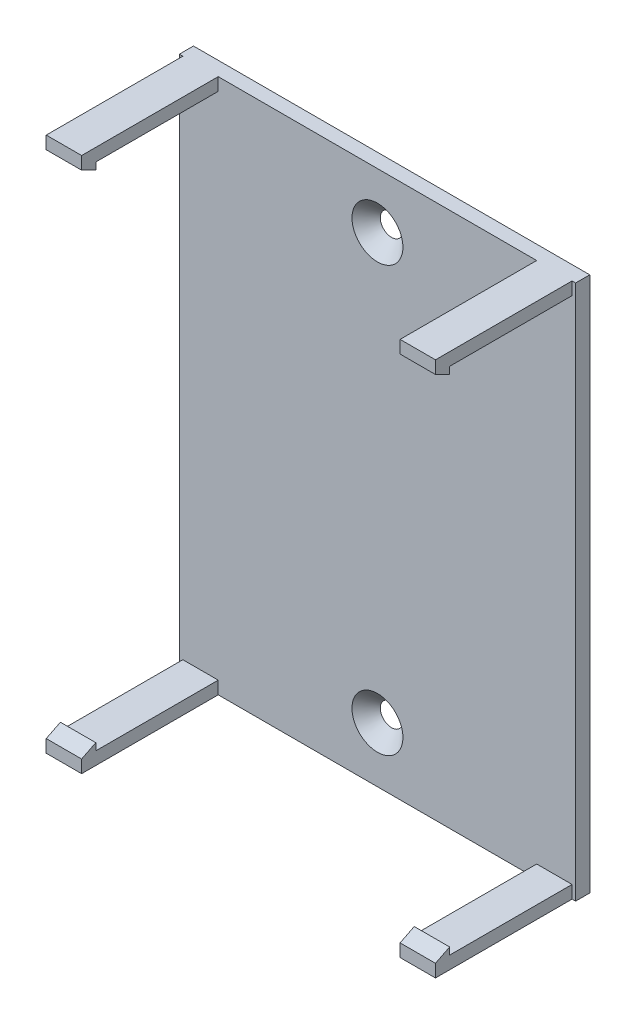
ISO-10303-21;
HEADER;
FILE_DESCRIPTION(('STEP AP214'),'2;1');
FILE_NAME('part.step','',(''),(''),'','','');
FILE_SCHEMA(('AUTOMOTIVE_DESIGN { 1 0 10303 214 1 1 1 1 }'));
ENDSEC;
DATA;
#1=APPLICATION_CONTEXT('core data for automotive mechanical design processes');
#2=APPLICATION_PROTOCOL_DEFINITION('international standard','automotive_design',2000,#1);
#3=PRODUCT_CONTEXT('',#1,'mechanical');
#4=PRODUCT('Part','Part','',(#3));
#5=PRODUCT_RELATED_PRODUCT_CATEGORY('part','',(#4));
#6=PRODUCT_DEFINITION_FORMATION('','',#4);
#7=PRODUCT_DEFINITION_CONTEXT('part definition',#1,'design');
#8=PRODUCT_DEFINITION('design','',#6,#7);
#9=PRODUCT_DEFINITION_SHAPE('','',#8);
#10=(LENGTH_UNIT() NAMED_UNIT(*) SI_UNIT(.MILLI.,.METRE.));
#11=(NAMED_UNIT(*) PLANE_ANGLE_UNIT() SI_UNIT($,.RADIAN.));
#12=(NAMED_UNIT(*) SI_UNIT($,.STERADIAN.) SOLID_ANGLE_UNIT());
#13=UNCERTAINTY_MEASURE_WITH_UNIT(LENGTH_MEASURE(1.E-05),#10,'distance_accuracy_value','');
#14=(GEOMETRIC_REPRESENTATION_CONTEXT(3) GLOBAL_UNCERTAINTY_ASSIGNED_CONTEXT((#13)) GLOBAL_UNIT_ASSIGNED_CONTEXT((#10,
#11,#12)) REPRESENTATION_CONTEXT('',''));
#15=CARTESIAN_POINT('',(0.,0.,0.));
#16=DIRECTION('',(0.,0.,1.));
#17=DIRECTION('',(1.,0.,0.));
#18=AXIS2_PLACEMENT_3D('',#15,#16,#17);
#19=CARTESIAN_POINT('',(0.,0.,2.));
#20=DIRECTION('',(0.,0.,1.));
#21=DIRECTION('',(1.,0.,0.));
#22=AXIS2_PLACEMENT_3D('',#19,#20,#21);
#23=PLANE('',#22);
#24=CARTESIAN_POINT('',(0.,-30.,2.));
#25=DIRECTION('',(0.,0.,1.));
#26=DIRECTION('',(1.,0.,0.));
#27=AXIS2_PLACEMENT_3D('',#24,#25,#26);
#28=CIRCLE('',#27,3.60000000000003);
#29=CARTESIAN_POINT('',(3.60000000000003,-30.,2.));
#30=VERTEX_POINT('',#29);
#31=EDGE_CURVE('E11',#30,#30,#28,.F.);
#32=ORIENTED_EDGE('',*,*,#31,.T.);
#33=EDGE_LOOP('',(#32));
#34=FACE_BOUND('',#33,.T.);
#35=CARTESIAN_POINT('',(0.,30.,2.));
#36=DIRECTION('',(0.,0.,1.));
#37=DIRECTION('',(1.,0.,0.));
#38=AXIS2_PLACEMENT_3D('',#35,#36,#37);
#39=CIRCLE('',#38,3.60000000000003);
#40=CARTESIAN_POINT('',(3.60000000000003,30.,2.));
#41=VERTEX_POINT('',#40);
#42=EDGE_CURVE('E44',#41,#41,#39,.F.);
#43=ORIENTED_EDGE('',*,*,#42,.T.);
#44=EDGE_LOOP('',(#43));
#45=FACE_BOUND('',#44,.T.);
#46=DIRECTION('',(1.,0.,0.));
#47=VECTOR('',#46,1.);
#48=CARTESIAN_POINT('',(-28.,-37.825,2.));
#49=LINE('',#48,#47);
#50=CARTESIAN_POINT('',(-22.5,-37.825,2.));
#51=VERTEX_POINT('',#50);
#52=CARTESIAN_POINT('',(22.5,-37.825,2.));
#53=VERTEX_POINT('',#52);
#54=EDGE_CURVE('E393',#51,#53,#49,.T.);
#55=ORIENTED_EDGE('',*,*,#54,.T.);
#56=DIRECTION('',(0.,-1.,0.));
#57=VECTOR('',#56,1.);
#58=CARTESIAN_POINT('',(22.5,-37.825,2.));
#59=LINE('',#58,#57);
#60=CARTESIAN_POINT('',(22.5,-36.025,2.));
#61=VERTEX_POINT('',#60);
#62=EDGE_CURVE('E478',#61,#53,#59,.T.);
#63=ORIENTED_EDGE('',*,*,#62,.F.);
#64=DIRECTION('',(-1.,0.,0.));
#65=VECTOR('',#64,1.);
#66=CARTESIAN_POINT('',(22.5,-36.025,2.));
#67=LINE('',#66,#65);
#68=CARTESIAN_POINT('',(27.5,-36.025,2.));
#69=VERTEX_POINT('',#68);
#70=EDGE_CURVE('E238',#69,#61,#67,.T.);
#71=ORIENTED_EDGE('',*,*,#70,.F.);
#72=DIRECTION('',(0.,1.,0.));
#73=VECTOR('',#72,1.);
#74=CARTESIAN_POINT('',(27.5,-37.825,2.));
#75=LINE('',#74,#73);
#76=CARTESIAN_POINT('',(27.5,-37.825,2.));
#77=VERTEX_POINT('',#76);
#78=EDGE_CURVE('E400',#77,#69,#75,.T.);
#79=ORIENTED_EDGE('',*,*,#78,.F.);
#80=CARTESIAN_POINT('',(28.,-37.825,2.));
#81=VERTEX_POINT('',#80);
#82=EDGE_CURVE('E391',#77,#81,#49,.T.);
#83=ORIENTED_EDGE('',*,*,#82,.T.);
#84=DIRECTION('',(0.,1.,0.));
#85=VECTOR('',#84,1.);
#86=CARTESIAN_POINT('',(28.,37.825,2.));
#87=LINE('',#86,#85);
#88=CARTESIAN_POINT('',(28.,37.825,2.));
#89=VERTEX_POINT('',#88);
#90=EDGE_CURVE('E351',#81,#89,#87,.T.);
#91=ORIENTED_EDGE('',*,*,#90,.T.);
#92=DIRECTION('',(-1.,0.,0.));
#93=VECTOR('',#92,1.);
#94=CARTESIAN_POINT('',(-28.,37.825,2.));
#95=LINE('',#94,#93);
#96=CARTESIAN_POINT('',(27.5,37.825,2.));
#97=VERTEX_POINT('',#96);
#98=EDGE_CURVE('E346',#89,#97,#95,.T.);
#99=ORIENTED_EDGE('',*,*,#98,.T.);
#100=DIRECTION('',(0.,1.,0.));
#101=VECTOR('',#100,1.);
#102=CARTESIAN_POINT('',(27.5,36.025,2.));
#103=LINE('',#102,#101);
#104=CARTESIAN_POINT('',(27.5,36.025,2.));
#105=VERTEX_POINT('',#104);
#106=EDGE_CURVE('E289',#105,#97,#103,.T.);
#107=ORIENTED_EDGE('',*,*,#106,.F.);
#108=DIRECTION('',(1.,0.,0.));
#109=VECTOR('',#108,1.);
#110=CARTESIAN_POINT('',(22.5,36.025,2.));
#111=LINE('',#110,#109);
#112=CARTESIAN_POINT('',(22.5,36.025,2.));
#113=VERTEX_POINT('',#112);
#114=EDGE_CURVE('E299',#113,#105,#111,.T.);
#115=ORIENTED_EDGE('',*,*,#114,.F.);
#116=DIRECTION('',(0.,-1.,0.));
#117=VECTOR('',#116,1.);
#118=CARTESIAN_POINT('',(22.5,36.025,2.));
#119=LINE('',#118,#117);
#120=CARTESIAN_POINT('',(22.5,37.825,2.));
#121=VERTEX_POINT('',#120);
#122=EDGE_CURVE('E284',#121,#113,#119,.T.);
#123=ORIENTED_EDGE('',*,*,#122,.F.);
#124=CARTESIAN_POINT('',(-22.5,37.825,2.));
#125=VERTEX_POINT('',#124);
#126=EDGE_CURVE('E344',#121,#125,#95,.T.);
#127=ORIENTED_EDGE('',*,*,#126,.T.);
#128=DIRECTION('',(0.,1.,0.));
#129=VECTOR('',#128,1.);
#130=CARTESIAN_POINT('',(-22.5,37.825,2.));
#131=LINE('',#130,#129);
#132=CARTESIAN_POINT('',(-22.5,36.025,2.));
#133=VERTEX_POINT('',#132);
#134=EDGE_CURVE('E318',#133,#125,#131,.T.);
#135=ORIENTED_EDGE('',*,*,#134,.F.);
#136=DIRECTION('',(1.,0.,0.));
#137=VECTOR('',#136,1.);
#138=CARTESIAN_POINT('',(-27.5,36.025,2.));
#139=LINE('',#138,#137);
#140=CARTESIAN_POINT('',(-27.5,36.025,2.));
#141=VERTEX_POINT('',#140);
#142=EDGE_CURVE('E326',#141,#133,#139,.T.);
#143=ORIENTED_EDGE('',*,*,#142,.F.);
#144=DIRECTION('',(0.,-1.,0.));
#145=VECTOR('',#144,1.);
#146=CARTESIAN_POINT('',(-27.5,37.825,2.));
#147=LINE('',#146,#145);
#148=CARTESIAN_POINT('',(-27.5,37.825,2.));
#149=VERTEX_POINT('',#148);
#150=EDGE_CURVE('E313',#149,#141,#147,.T.);
#151=ORIENTED_EDGE('',*,*,#150,.F.);
#152=CARTESIAN_POINT('',(-28.,37.825,2.));
#153=VERTEX_POINT('',#152);
#154=EDGE_CURVE('E347',#149,#153,#95,.T.);
#155=ORIENTED_EDGE('',*,*,#154,.T.);
#156=DIRECTION('',(0.,-1.,0.));
#157=VECTOR('',#156,1.);
#158=CARTESIAN_POINT('',(-28.,37.825,2.));
#159=LINE('',#158,#157);
#160=CARTESIAN_POINT('',(-28.,-37.825,2.));
#161=VERTEX_POINT('',#160);
#162=EDGE_CURVE('E375',#153,#161,#159,.T.);
#163=ORIENTED_EDGE('',*,*,#162,.T.);
#164=CARTESIAN_POINT('',(-27.5,-37.825,2.));
#165=VERTEX_POINT('',#164);
#166=EDGE_CURVE('E392',#161,#165,#49,.T.);
#167=ORIENTED_EDGE('',*,*,#166,.T.);
#168=DIRECTION('',(0.,-1.,0.));
#169=VECTOR('',#168,1.);
#170=CARTESIAN_POINT('',(-27.5,-37.825,2.));
#171=LINE('',#170,#169);
#172=CARTESIAN_POINT('',(-27.5,-36.025,2.));
#173=VERTEX_POINT('',#172);
#174=EDGE_CURVE('E254',#173,#165,#171,.T.);
#175=ORIENTED_EDGE('',*,*,#174,.F.);
#176=DIRECTION('',(-1.,0.,0.));
#177=VECTOR('',#176,1.);
#178=CARTESIAN_POINT('',(-27.5,-36.025,2.));
#179=LINE('',#178,#177);
#180=CARTESIAN_POINT('',(-22.5,-36.025,2.));
#181=VERTEX_POINT('',#180);
#182=EDGE_CURVE('E259',#181,#173,#179,.T.);
#183=ORIENTED_EDGE('',*,*,#182,.F.);
#184=DIRECTION('',(0.,1.,0.));
#185=VECTOR('',#184,1.);
#186=CARTESIAN_POINT('',(-22.5,-37.825,2.));
#187=LINE('',#186,#185);
#188=EDGE_CURVE('E270',#51,#181,#187,.T.);
#189=ORIENTED_EDGE('',*,*,#188,.F.);
#190=EDGE_LOOP('',(#55,#63,#71,#79,#83,#91,#99,#107,#115,#123,#127,#135,#143,#151,#155,#163,
#167,#175,#183,#189));
#191=FACE_BOUND('',#190,.T.);
#192=ADVANCED_FACE('F36',(#34,#45,#191),#23,.T.);
#193=CARTESIAN_POINT('',(-28.,37.825,2.));
#194=DIRECTION('',(1.,0.,0.));
#195=DIRECTION('',(0.,1.,0.));
#196=AXIS2_PLACEMENT_3D('',#193,#194,#195);
#197=PLANE('',#196);
#198=DIRECTION('',(0.,-1.,0.));
#199=VECTOR('',#198,1.);
#200=CARTESIAN_POINT('',(-28.,37.825,0.));
#201=LINE('',#200,#199);
#202=CARTESIAN_POINT('',(-28.,37.825,0.));
#203=VERTEX_POINT('',#202);
#204=CARTESIAN_POINT('',(-28.,-37.825,0.));
#205=VERTEX_POINT('',#204);
#206=EDGE_CURVE('E353',#203,#205,#201,.T.);
#207=ORIENTED_EDGE('',*,*,#206,.T.);
#208=DIRECTION('',(0.,0.,-1.));
#209=VECTOR('',#208,1.);
#210=CARTESIAN_POINT('',(-28.,-37.825,2.));
#211=LINE('',#210,#209);
#212=EDGE_CURVE('E362',#161,#205,#211,.T.);
#213=ORIENTED_EDGE('',*,*,#212,.F.);
#214=ORIENTED_EDGE('',*,*,#162,.F.);
#215=DIRECTION('',(0.,0.,-1.));
#216=VECTOR('',#215,1.);
#217=CARTESIAN_POINT('',(-28.,37.825,2.));
#218=LINE('',#217,#216);
#219=EDGE_CURVE('E361',#153,#203,#218,.T.);
#220=ORIENTED_EDGE('',*,*,#219,.T.);
#221=EDGE_LOOP('',(#207,#213,#214,#220));
#222=FACE_BOUND('',#221,.T.);
#223=ADVANCED_FACE('F458',(#222),#197,.F.);
#224=CARTESIAN_POINT('',(-28.,-37.825,2.));
#225=DIRECTION('',(0.,1.,0.));
#226=DIRECTION('',(-1.,0.,0.));
#227=AXIS2_PLACEMENT_3D('',#224,#225,#226);
#228=PLANE('',#227);
#229=DIRECTION('',(1.,0.,0.));
#230=VECTOR('',#229,1.);
#231=CARTESIAN_POINT('',(-28.,-37.825,0.));
#232=LINE('',#231,#230);
#233=CARTESIAN_POINT('',(28.,-37.825,0.));
#234=VERTEX_POINT('',#233);
#235=EDGE_CURVE('E377',#205,#234,#232,.T.);
#236=ORIENTED_EDGE('',*,*,#235,.T.);
#237=DIRECTION('',(0.,0.,-1.));
#238=VECTOR('',#237,1.);
#239=CARTESIAN_POINT('',(28.,-37.825,2.));
#240=LINE('',#239,#238);
#241=EDGE_CURVE('E365',#81,#234,#240,.T.);
#242=ORIENTED_EDGE('',*,*,#241,.F.);
#243=ORIENTED_EDGE('',*,*,#82,.F.);
#244=DIRECTION('',(0.,0.,-1.));
#245=VECTOR('',#244,1.);
#246=CARTESIAN_POINT('',(27.5,-37.825,21.3));
#247=LINE('',#246,#245);
#248=CARTESIAN_POINT('',(27.5,-37.825,21.3));
#249=VERTEX_POINT('',#248);
#250=EDGE_CURVE('E241',#249,#77,#247,.T.);
#251=ORIENTED_EDGE('',*,*,#250,.F.);
#252=DIRECTION('',(1.,0.,0.));
#253=VECTOR('',#252,1.);
#254=CARTESIAN_POINT('',(22.5,-37.825,21.3));
#255=LINE('',#254,#253);
#256=CARTESIAN_POINT('',(22.5,-37.825,21.3));
#257=VERTEX_POINT('',#256);
#258=EDGE_CURVE('E480',#257,#249,#255,.T.);
#259=ORIENTED_EDGE('',*,*,#258,.F.);
#260=DIRECTION('',(0.,0.,-1.));
#261=VECTOR('',#260,1.);
#262=CARTESIAN_POINT('',(22.5,-37.825,21.3));
#263=LINE('',#262,#261);
#264=EDGE_CURVE('E251',#257,#53,#263,.T.);
#265=ORIENTED_EDGE('',*,*,#264,.T.);
#266=ORIENTED_EDGE('',*,*,#54,.F.);
#267=DIRECTION('',(0.,0.,-1.));
#268=VECTOR('',#267,1.);
#269=CARTESIAN_POINT('',(-22.5,-37.825,21.3));
#270=LINE('',#269,#268);
#271=CARTESIAN_POINT('',(-22.5,-37.825,21.3));
#272=VERTEX_POINT('',#271);
#273=EDGE_CURVE('E278',#272,#51,#270,.T.);
#274=ORIENTED_EDGE('',*,*,#273,.F.);
#275=DIRECTION('',(1.,0.,0.));
#276=VECTOR('',#275,1.);
#277=CARTESIAN_POINT('',(-27.5,-37.825,21.3));
#278=LINE('',#277,#276);
#279=CARTESIAN_POINT('',(-27.5,-37.825,21.3));
#280=VERTEX_POINT('',#279);
#281=EDGE_CURVE('E258',#280,#272,#278,.T.);
#282=ORIENTED_EDGE('',*,*,#281,.F.);
#283=DIRECTION('',(0.,0.,-1.));
#284=VECTOR('',#283,1.);
#285=CARTESIAN_POINT('',(-27.5,-37.825,21.3));
#286=LINE('',#285,#284);
#287=EDGE_CURVE('E281',#280,#165,#286,.T.);
#288=ORIENTED_EDGE('',*,*,#287,.T.);
#289=ORIENTED_EDGE('',*,*,#166,.F.);
#290=ORIENTED_EDGE('',*,*,#212,.T.);
#291=EDGE_LOOP('',(#236,#242,#243,#251,#259,#265,#266,#274,#282,#288,#289,#290));
#292=FACE_BOUND('',#291,.T.);
#293=ADVANCED_FACE('F402',(#292),#228,.F.);
#294=CARTESIAN_POINT('',(28.,37.825,2.));
#295=DIRECTION('',(-1.,0.,0.));
#296=DIRECTION('',(0.,-1.,0.));
#297=AXIS2_PLACEMENT_3D('',#294,#295,#296);
#298=PLANE('',#297);
#299=DIRECTION('',(0.,1.,0.));
#300=VECTOR('',#299,1.);
#301=CARTESIAN_POINT('',(28.,37.825,0.));
#302=LINE('',#301,#300);
#303=CARTESIAN_POINT('',(28.,37.825,0.));
#304=VERTEX_POINT('',#303);
#305=EDGE_CURVE('E376',#234,#304,#302,.T.);
#306=ORIENTED_EDGE('',*,*,#305,.T.);
#307=DIRECTION('',(0.,0.,-1.));
#308=VECTOR('',#307,1.);
#309=CARTESIAN_POINT('',(28.,37.825,2.));
#310=LINE('',#309,#308);
#311=EDGE_CURVE('E368',#89,#304,#310,.T.);
#312=ORIENTED_EDGE('',*,*,#311,.F.);
#313=ORIENTED_EDGE('',*,*,#90,.F.);
#314=ORIENTED_EDGE('',*,*,#241,.T.);
#315=EDGE_LOOP('',(#306,#312,#313,#314));
#316=FACE_BOUND('',#315,.T.);
#317=ADVANCED_FACE('F405',(#316),#298,.F.);
#318=CARTESIAN_POINT('',(-28.,37.825,2.));
#319=DIRECTION('',(0.,-1.,0.));
#320=DIRECTION('',(1.,0.,0.));
#321=AXIS2_PLACEMENT_3D('',#318,#319,#320);
#322=PLANE('',#321);
#323=DIRECTION('',(-1.,0.,0.));
#324=VECTOR('',#323,1.);
#325=CARTESIAN_POINT('',(-28.,37.825,0.));
#326=LINE('',#325,#324);
#327=EDGE_CURVE('E373',#304,#203,#326,.T.);
#328=ORIENTED_EDGE('',*,*,#327,.T.);
#329=ORIENTED_EDGE('',*,*,#219,.F.);
#330=ORIENTED_EDGE('',*,*,#154,.F.);
#331=DIRECTION('',(0.,0.,-1.));
#332=VECTOR('',#331,1.);
#333=CARTESIAN_POINT('',(-27.5,37.825,21.3));
#334=LINE('',#333,#332);
#335=CARTESIAN_POINT('',(-27.5,37.825,21.3));
#336=VERTEX_POINT('',#335);
#337=EDGE_CURVE('E325',#336,#149,#334,.T.);
#338=ORIENTED_EDGE('',*,*,#337,.F.);
#339=DIRECTION('',(-1.,0.,0.));
#340=VECTOR('',#339,1.);
#341=CARTESIAN_POINT('',(-27.5,37.825,21.3));
#342=LINE('',#341,#340);
#343=CARTESIAN_POINT('',(-22.5,37.825,21.3));
#344=VERTEX_POINT('',#343);
#345=EDGE_CURVE('E323',#344,#336,#342,.T.);
#346=ORIENTED_EDGE('',*,*,#345,.F.);
#347=DIRECTION('',(0.,0.,-1.));
#348=VECTOR('',#347,1.);
#349=CARTESIAN_POINT('',(-22.5,37.825,21.3));
#350=LINE('',#349,#348);
#351=EDGE_CURVE('E339',#344,#125,#350,.T.);
#352=ORIENTED_EDGE('',*,*,#351,.T.);
#353=ORIENTED_EDGE('',*,*,#126,.F.);
#354=DIRECTION('',(0.,0.,-1.));
#355=VECTOR('',#354,1.);
#356=CARTESIAN_POINT('',(22.5,37.825,21.3));
#357=LINE('',#356,#355);
#358=CARTESIAN_POINT('',(22.5,37.825,21.3));
#359=VERTEX_POINT('',#358);
#360=EDGE_CURVE('E296',#359,#121,#357,.T.);
#361=ORIENTED_EDGE('',*,*,#360,.F.);
#362=DIRECTION('',(-1.,0.,0.));
#363=VECTOR('',#362,1.);
#364=CARTESIAN_POINT('',(22.5,37.825,21.3));
#365=LINE('',#364,#363);
#366=CARTESIAN_POINT('',(27.5,37.825,21.3));
#367=VERTEX_POINT('',#366);
#368=EDGE_CURVE('E294',#367,#359,#365,.T.);
#369=ORIENTED_EDGE('',*,*,#368,.F.);
#370=DIRECTION('',(0.,0.,-1.));
#371=VECTOR('',#370,1.);
#372=CARTESIAN_POINT('',(27.5,37.825,21.3));
#373=LINE('',#372,#371);
#374=EDGE_CURVE('E306',#367,#97,#373,.T.);
#375=ORIENTED_EDGE('',*,*,#374,.T.);
#376=ORIENTED_EDGE('',*,*,#98,.F.);
#377=ORIENTED_EDGE('',*,*,#311,.T.);
#378=EDGE_LOOP('',(#328,#329,#330,#338,#346,#352,#353,#361,#369,#375,#376,#377));
#379=FACE_BOUND('',#378,.T.);
#380=ADVANCED_FACE('F409',(#379),#322,.F.);
#381=CARTESIAN_POINT('',(0.,0.,0.));
#382=DIRECTION('',(0.,0.,1.));
#383=DIRECTION('',(1.,0.,0.));
#384=AXIS2_PLACEMENT_3D('',#381,#382,#383);
#385=PLANE('',#384);
#386=CARTESIAN_POINT('',(0.,-30.,0.));
#387=DIRECTION('',(0.,0.,1.));
#388=DIRECTION('',(1.,0.,0.));
#389=AXIS2_PLACEMENT_3D('',#386,#387,#388);
#390=CIRCLE('',#389,1.6);
#391=CARTESIAN_POINT('',(1.6,-30.,0.));
#392=VERTEX_POINT('',#391);
#393=EDGE_CURVE('E527',#392,#392,#390,.T.);
#394=ORIENTED_EDGE('',*,*,#393,.T.);
#395=EDGE_LOOP('',(#394));
#396=FACE_BOUND('',#395,.T.);
#397=CARTESIAN_POINT('',(0.,30.,0.));
#398=DIRECTION('',(0.,0.,1.));
#399=DIRECTION('',(1.,0.,0.));
#400=AXIS2_PLACEMENT_3D('',#397,#398,#399);
#401=CIRCLE('',#400,1.6);
#402=CARTESIAN_POINT('',(1.6,30.,0.));
#403=VERTEX_POINT('',#402);
#404=EDGE_CURVE('E235',#403,#403,#401,.T.);
#405=ORIENTED_EDGE('',*,*,#404,.T.);
#406=EDGE_LOOP('',(#405));
#407=FACE_BOUND('',#406,.T.);
#408=ORIENTED_EDGE('',*,*,#206,.F.);
#409=ORIENTED_EDGE('',*,*,#327,.F.);
#410=ORIENTED_EDGE('',*,*,#305,.F.);
#411=ORIENTED_EDGE('',*,*,#235,.F.);
#412=EDGE_LOOP('',(#408,#409,#410,#411));
#413=FACE_BOUND('',#412,.T.);
#414=ADVANCED_FACE('F531',(#396,#407,#413),#385,.F.);
#415=CARTESIAN_POINT('',(-27.5,37.825,21.3));
#416=DIRECTION('',(1.,0.,0.));
#417=DIRECTION('',(0.,1.,0.));
#418=AXIS2_PLACEMENT_3D('',#415,#416,#417);
#419=PLANE('',#418);
#420=ORIENTED_EDGE('',*,*,#150,.T.);
#421=DIRECTION('',(0.,0.,-1.));
#422=VECTOR('',#421,1.);
#423=CARTESIAN_POINT('',(-27.5,36.025,21.3));
#424=LINE('',#423,#422);
#425=CARTESIAN_POINT('',(-27.5,36.025,19.3));
#426=VERTEX_POINT('',#425);
#427=EDGE_CURVE('E381',#426,#141,#424,.T.);
#428=ORIENTED_EDGE('',*,*,#427,.F.);
#429=DIRECTION('',(0.,-1.,0.));
#430=VECTOR('',#429,1.);
#431=CARTESIAN_POINT('',(-27.5,35.025,19.3));
#432=LINE('',#431,#430);
#433=CARTESIAN_POINT('',(-27.5,35.025,19.3));
#434=VERTEX_POINT('',#433);
#435=EDGE_CURVE('E496',#426,#434,#432,.T.);
#436=ORIENTED_EDGE('',*,*,#435,.T.);
#437=DIRECTION('',(0.,0.447213595499958,0.894427190999916));
#438=VECTOR('',#437,1.);
#439=CARTESIAN_POINT('',(-27.5,36.025,21.3));
#440=LINE('',#439,#438);
#441=CARTESIAN_POINT('',(-27.5,36.025,21.3));
#442=VERTEX_POINT('',#441);
#443=EDGE_CURVE('E493',#434,#442,#440,.T.);
#444=ORIENTED_EDGE('',*,*,#443,.T.);
#445=DIRECTION('',(0.,-1.,0.));
#446=VECTOR('',#445,1.);
#447=CARTESIAN_POINT('',(-27.5,37.825,21.3));
#448=LINE('',#447,#446);
#449=EDGE_CURVE('E314',#336,#442,#448,.T.);
#450=ORIENTED_EDGE('',*,*,#449,.F.);
#451=ORIENTED_EDGE('',*,*,#337,.T.);
#452=EDGE_LOOP('',(#420,#428,#436,#444,#450,#451));
#453=FACE_BOUND('',#452,.T.);
#454=ADVANCED_FACE('F449',(#453),#419,.F.);
#455=CARTESIAN_POINT('',(-27.5,36.025,21.3));
#456=DIRECTION('',(0.,1.,0.));
#457=DIRECTION('',(0.,0.,1.));
#458=AXIS2_PLACEMENT_3D('',#455,#456,#457);
#459=PLANE('',#458);
#460=DIRECTION('',(0.,0.,-1.));
#461=VECTOR('',#460,1.);
#462=CARTESIAN_POINT('',(-22.5,36.025,21.3));
#463=LINE('',#462,#461);
#464=CARTESIAN_POINT('',(-22.5,36.025,19.3));
#465=VERTEX_POINT('',#464);
#466=EDGE_CURVE('E331',#465,#133,#463,.T.);
#467=ORIENTED_EDGE('',*,*,#466,.F.);
#468=DIRECTION('',(-1.,0.,0.));
#469=VECTOR('',#468,1.);
#470=CARTESIAN_POINT('',(-20.2639320225002,36.025,19.3));
#471=LINE('',#470,#469);
#472=EDGE_CURVE('E444',#465,#426,#471,.T.);
#473=ORIENTED_EDGE('',*,*,#472,.T.);
#474=ORIENTED_EDGE('',*,*,#427,.T.);
#475=ORIENTED_EDGE('',*,*,#142,.T.);
#476=EDGE_LOOP('',(#467,#473,#474,#475));
#477=FACE_BOUND('',#476,.T.);
#478=ADVANCED_FACE('F443',(#477),#459,.F.);
#479=CARTESIAN_POINT('',(-22.5,37.825,21.3));
#480=DIRECTION('',(-1.,0.,0.));
#481=DIRECTION('',(0.,0.,1.));
#482=AXIS2_PLACEMENT_3D('',#479,#480,#481);
#483=PLANE('',#482);
#484=ORIENTED_EDGE('',*,*,#134,.T.);
#485=ORIENTED_EDGE('',*,*,#351,.F.);
#486=DIRECTION('',(0.,1.,0.));
#487=VECTOR('',#486,1.);
#488=CARTESIAN_POINT('',(-22.5,37.825,21.3));
#489=LINE('',#488,#487);
#490=CARTESIAN_POINT('',(-22.5,36.025,21.3));
#491=VERTEX_POINT('',#490);
#492=EDGE_CURVE('E321',#491,#344,#489,.T.);
#493=ORIENTED_EDGE('',*,*,#492,.F.);
#494=DIRECTION('',(0.,-0.447213595499958,-0.894427190999916));
#495=VECTOR('',#494,1.);
#496=CARTESIAN_POINT('',(-22.5,36.025,21.3));
#497=LINE('',#496,#495);
#498=CARTESIAN_POINT('',(-22.5,35.025,19.3));
#499=VERTEX_POINT('',#498);
#500=EDGE_CURVE('E483',#491,#499,#497,.T.);
#501=ORIENTED_EDGE('',*,*,#500,.T.);
#502=DIRECTION('',(0.,1.,0.));
#503=VECTOR('',#502,1.);
#504=CARTESIAN_POINT('',(-22.5,35.025,19.3));
#505=LINE('',#504,#503);
#506=EDGE_CURVE('E441',#499,#465,#505,.T.);
#507=ORIENTED_EDGE('',*,*,#506,.T.);
#508=ORIENTED_EDGE('',*,*,#466,.T.);
#509=EDGE_LOOP('',(#484,#485,#493,#501,#507,#508));
#510=FACE_BOUND('',#509,.T.);
#511=ADVANCED_FACE('F437',(#510),#483,.F.);
#512=CARTESIAN_POINT('',(0.,0.,21.3));
#513=DIRECTION('',(0.,0.,1.));
#514=DIRECTION('',(1.,0.,0.));
#515=AXIS2_PLACEMENT_3D('',#512,#513,#514);
#516=PLANE('',#515);
#517=ORIENTED_EDGE('',*,*,#449,.T.);
#518=DIRECTION('',(1.,0.,0.));
#519=VECTOR('',#518,1.);
#520=CARTESIAN_POINT('',(-27.5,36.025,21.3));
#521=LINE('',#520,#519);
#522=EDGE_CURVE('E317',#442,#491,#521,.T.);
#523=ORIENTED_EDGE('',*,*,#522,.T.);
#524=ORIENTED_EDGE('',*,*,#492,.T.);
#525=ORIENTED_EDGE('',*,*,#345,.T.);
#526=EDGE_LOOP('',(#517,#523,#524,#525));
#527=FACE_BOUND('',#526,.T.);
#528=ADVANCED_FACE('F601',(#527),#516,.T.);
#529=CARTESIAN_POINT('',(22.5,36.025,21.3));
#530=DIRECTION('',(1.,0.,0.));
#531=DIRECTION('',(0.,1.,0.));
#532=AXIS2_PLACEMENT_3D('',#529,#530,#531);
#533=PLANE('',#532);
#534=ORIENTED_EDGE('',*,*,#122,.T.);
#535=DIRECTION('',(0.,0.,-1.));
#536=VECTOR('',#535,1.);
#537=CARTESIAN_POINT('',(22.5,36.025,21.3));
#538=LINE('',#537,#536);
#539=CARTESIAN_POINT('',(22.5,36.0250000000001,19.3));
#540=VERTEX_POINT('',#539);
#541=EDGE_CURVE('E311',#540,#113,#538,.T.);
#542=ORIENTED_EDGE('',*,*,#541,.F.);
#543=DIRECTION('',(0.,-1.,0.));
#544=VECTOR('',#543,1.);
#545=CARTESIAN_POINT('',(22.5,36.0250000000001,19.3));
#546=LINE('',#545,#544);
#547=CARTESIAN_POINT('',(22.5,35.0250000000001,19.3));
#548=VERTEX_POINT('',#547);
#549=EDGE_CURVE('E506',#540,#548,#546,.T.);
#550=ORIENTED_EDGE('',*,*,#549,.T.);
#551=DIRECTION('',(0.,0.447213595499958,0.894427190999916));
#552=VECTOR('',#551,1.);
#553=CARTESIAN_POINT('',(22.5,35.0250000000001,19.3));
#554=LINE('',#553,#552);
#555=CARTESIAN_POINT('',(22.5,36.0250000000001,21.3));
#556=VERTEX_POINT('',#555);
#557=EDGE_CURVE('E503',#548,#556,#554,.T.);
#558=ORIENTED_EDGE('',*,*,#557,.T.);
#559=DIRECTION('',(0.,-1.,0.));
#560=VECTOR('',#559,1.);
#561=CARTESIAN_POINT('',(22.5,36.025,21.3));
#562=LINE('',#561,#560);
#563=EDGE_CURVE('E285',#359,#556,#562,.T.);
#564=ORIENTED_EDGE('',*,*,#563,.F.);
#565=ORIENTED_EDGE('',*,*,#360,.T.);
#566=EDGE_LOOP('',(#534,#542,#550,#558,#564,#565));
#567=FACE_BOUND('',#566,.T.);
#568=ADVANCED_FACE('F428',(#567),#533,.F.);
#569=CARTESIAN_POINT('',(22.5,36.025,21.3));
#570=DIRECTION('',(0.,1.,0.));
#571=DIRECTION('',(0.,0.,1.));
#572=AXIS2_PLACEMENT_3D('',#569,#570,#571);
#573=PLANE('',#572);
#574=DIRECTION('',(0.,0.,-1.));
#575=VECTOR('',#574,1.);
#576=CARTESIAN_POINT('',(27.5,36.025,21.3));
#577=LINE('',#576,#575);
#578=CARTESIAN_POINT('',(27.5,36.0250000000001,19.3));
#579=VERTEX_POINT('',#578);
#580=EDGE_CURVE('E309',#579,#105,#577,.T.);
#581=ORIENTED_EDGE('',*,*,#580,.F.);
#582=DIRECTION('',(-1.,0.,0.));
#583=VECTOR('',#582,1.);
#584=CARTESIAN_POINT('',(29.7360679774998,36.0250000000001,19.3));
#585=LINE('',#584,#583);
#586=EDGE_CURVE('E424',#579,#540,#585,.T.);
#587=ORIENTED_EDGE('',*,*,#586,.T.);
#588=ORIENTED_EDGE('',*,*,#541,.T.);
#589=ORIENTED_EDGE('',*,*,#114,.T.);
#590=EDGE_LOOP('',(#581,#587,#588,#589));
#591=FACE_BOUND('',#590,.T.);
#592=ADVANCED_FACE('F423',(#591),#573,.F.);
#593=CARTESIAN_POINT('',(27.5,36.025,21.3));
#594=DIRECTION('',(-1.,0.,0.));
#595=DIRECTION('',(0.,-1.,0.));
#596=AXIS2_PLACEMENT_3D('',#593,#594,#595);
#597=PLANE('',#596);
#598=ORIENTED_EDGE('',*,*,#106,.T.);
#599=ORIENTED_EDGE('',*,*,#374,.F.);
#600=DIRECTION('',(0.,1.,0.));
#601=VECTOR('',#600,1.);
#602=CARTESIAN_POINT('',(27.5,36.025,21.3));
#603=LINE('',#602,#601);
#604=CARTESIAN_POINT('',(27.5,36.025,21.3));
#605=VERTEX_POINT('',#604);
#606=EDGE_CURVE('E292',#605,#367,#603,.T.);
#607=ORIENTED_EDGE('',*,*,#606,.F.);
#608=DIRECTION('',(0.,-0.447213595499958,-0.894427190999916));
#609=VECTOR('',#608,1.);
#610=CARTESIAN_POINT('',(27.5,35.0250000000001,19.3));
#611=LINE('',#610,#609);
#612=CARTESIAN_POINT('',(27.5,35.0250000000001,19.3));
#613=VERTEX_POINT('',#612);
#614=EDGE_CURVE('E500',#605,#613,#611,.T.);
#615=ORIENTED_EDGE('',*,*,#614,.T.);
#616=DIRECTION('',(0.,1.,0.));
#617=VECTOR('',#616,1.);
#618=CARTESIAN_POINT('',(27.5,36.0250000000001,19.3));
#619=LINE('',#618,#617);
#620=EDGE_CURVE('E419',#613,#579,#619,.T.);
#621=ORIENTED_EDGE('',*,*,#620,.T.);
#622=ORIENTED_EDGE('',*,*,#580,.T.);
#623=EDGE_LOOP('',(#598,#599,#607,#615,#621,#622));
#624=FACE_BOUND('',#623,.T.);
#625=ADVANCED_FACE('F415',(#624),#597,.F.);
#626=CARTESIAN_POINT('',(0.,0.,21.3));
#627=DIRECTION('',(0.,0.,-1.));
#628=DIRECTION('',(-1.,0.,0.));
#629=AXIS2_PLACEMENT_3D('',#626,#627,#628);
#630=PLANE('',#629);
#631=ORIENTED_EDGE('',*,*,#563,.T.);
#632=DIRECTION('',(1.,0.,0.));
#633=VECTOR('',#632,1.);
#634=CARTESIAN_POINT('',(22.5,36.025,21.3));
#635=LINE('',#634,#633);
#636=EDGE_CURVE('E288',#556,#605,#635,.T.);
#637=ORIENTED_EDGE('',*,*,#636,.T.);
#638=ORIENTED_EDGE('',*,*,#606,.T.);
#639=ORIENTED_EDGE('',*,*,#368,.T.);
#640=EDGE_LOOP('',(#631,#637,#638,#639));
#641=FACE_BOUND('',#640,.T.);
#642=ADVANCED_FACE('F625',(#641),#630,.F.);
#643=CARTESIAN_POINT('',(-27.5,-37.825,21.3));
#644=DIRECTION('',(1.,0.,0.));
#645=DIRECTION('',(0.,0.,-1.));
#646=AXIS2_PLACEMENT_3D('',#643,#644,#645);
#647=PLANE('',#646);
#648=ORIENTED_EDGE('',*,*,#174,.T.);
#649=ORIENTED_EDGE('',*,*,#287,.F.);
#650=DIRECTION('',(0.,-1.,0.));
#651=VECTOR('',#650,1.);
#652=CARTESIAN_POINT('',(-27.5,-37.825,21.3));
#653=LINE('',#652,#651);
#654=CARTESIAN_POINT('',(-27.5,-36.025,21.3));
#655=VERTEX_POINT('',#654);
#656=EDGE_CURVE('E255',#655,#280,#653,.T.);
#657=ORIENTED_EDGE('',*,*,#656,.F.);
#658=DIRECTION('',(0.,0.447213595499958,-0.894427190999916));
#659=VECTOR('',#658,1.);
#660=CARTESIAN_POINT('',(-27.5,-36.025,21.3));
#661=LINE('',#660,#659);
#662=CARTESIAN_POINT('',(-27.5,-35.025,19.3));
#663=VERTEX_POINT('',#662);
#664=EDGE_CURVE('E516',#655,#663,#661,.T.);
#665=ORIENTED_EDGE('',*,*,#664,.T.);
#666=DIRECTION('',(0.,-1.,0.));
#667=VECTOR('',#666,1.);
#668=CARTESIAN_POINT('',(-27.5,-35.025,19.3));
#669=LINE('',#668,#667);
#670=CARTESIAN_POINT('',(-27.5,-36.025,19.3));
#671=VERTEX_POINT('',#670);
#672=EDGE_CURVE('E513',#663,#671,#669,.T.);
#673=ORIENTED_EDGE('',*,*,#672,.T.);
#674=DIRECTION('',(0.,0.,-1.));
#675=VECTOR('',#674,1.);
#676=CARTESIAN_POINT('',(-27.5,-36.025,21.3));
#677=LINE('',#676,#675);
#678=EDGE_CURVE('E267',#671,#173,#677,.T.);
#679=ORIENTED_EDGE('',*,*,#678,.T.);
#680=EDGE_LOOP('',(#648,#649,#657,#665,#673,#679));
#681=FACE_BOUND('',#680,.T.);
#682=ADVANCED_FACE('F463',(#681),#647,.F.);
#683=CARTESIAN_POINT('',(-22.5,-37.825,21.3));
#684=DIRECTION('',(-1.,0.,0.));
#685=DIRECTION('',(0.,0.,1.));
#686=AXIS2_PLACEMENT_3D('',#683,#684,#685);
#687=PLANE('',#686);
#688=ORIENTED_EDGE('',*,*,#188,.T.);
#689=DIRECTION('',(0.,0.,-1.));
#690=VECTOR('',#689,1.);
#691=CARTESIAN_POINT('',(-22.5,-36.025,21.3));
#692=LINE('',#691,#690);
#693=CARTESIAN_POINT('',(-22.5,-36.025,19.3));
#694=VERTEX_POINT('',#693);
#695=EDGE_CURVE('E276',#694,#181,#692,.T.);
#696=ORIENTED_EDGE('',*,*,#695,.F.);
#697=DIRECTION('',(0.,1.,0.));
#698=VECTOR('',#697,1.);
#699=CARTESIAN_POINT('',(-22.5,-35.025,19.3));
#700=LINE('',#699,#698);
#701=CARTESIAN_POINT('',(-22.5,-35.025,19.3));
#702=VERTEX_POINT('',#701);
#703=EDGE_CURVE('E475',#694,#702,#700,.T.);
#704=ORIENTED_EDGE('',*,*,#703,.T.);
#705=DIRECTION('',(0.,-0.447213595499958,0.894427190999916));
#706=VECTOR('',#705,1.);
#707=CARTESIAN_POINT('',(-22.5,-36.025,21.3));
#708=LINE('',#707,#706);
#709=CARTESIAN_POINT('',(-22.5,-36.025,21.3));
#710=VERTEX_POINT('',#709);
#711=EDGE_CURVE('E508',#702,#710,#708,.T.);
#712=ORIENTED_EDGE('',*,*,#711,.T.);
#713=DIRECTION('',(0.,1.,0.));
#714=VECTOR('',#713,1.);
#715=CARTESIAN_POINT('',(-22.5,-37.825,21.3));
#716=LINE('',#715,#714);
#717=EDGE_CURVE('E261',#272,#710,#716,.T.);
#718=ORIENTED_EDGE('',*,*,#717,.F.);
#719=ORIENTED_EDGE('',*,*,#273,.T.);
#720=EDGE_LOOP('',(#688,#696,#704,#712,#718,#719));
#721=FACE_BOUND('',#720,.T.);
#722=ADVANCED_FACE('F474',(#721),#687,.F.);
#723=CARTESIAN_POINT('',(-27.5,-36.025,21.3));
#724=DIRECTION('',(0.,-1.,0.));
#725=DIRECTION('',(1.,0.,0.));
#726=AXIS2_PLACEMENT_3D('',#723,#724,#725);
#727=PLANE('',#726);
#728=ORIENTED_EDGE('',*,*,#678,.F.);
#729=DIRECTION('',(-1.,0.,0.));
#730=VECTOR('',#729,1.);
#731=CARTESIAN_POINT('',(-20.2639320225002,-36.025,19.3));
#732=LINE('',#731,#730);
#733=EDGE_CURVE('E472',#694,#671,#732,.T.);
#734=ORIENTED_EDGE('',*,*,#733,.F.);
#735=ORIENTED_EDGE('',*,*,#695,.T.);
#736=ORIENTED_EDGE('',*,*,#182,.T.);
#737=EDGE_LOOP('',(#728,#734,#735,#736));
#738=FACE_BOUND('',#737,.T.);
#739=ADVANCED_FACE('F469',(#738),#727,.F.);
#740=CARTESIAN_POINT('',(0.,0.,21.3));
#741=DIRECTION('',(0.,0.,-1.));
#742=DIRECTION('',(-1.,0.,0.));
#743=AXIS2_PLACEMENT_3D('',#740,#741,#742);
#744=PLANE('',#743);
#745=ORIENTED_EDGE('',*,*,#656,.T.);
#746=ORIENTED_EDGE('',*,*,#281,.T.);
#747=ORIENTED_EDGE('',*,*,#717,.T.);
#748=DIRECTION('',(-1.,0.,0.));
#749=VECTOR('',#748,1.);
#750=CARTESIAN_POINT('',(-27.5,-36.025,21.3));
#751=LINE('',#750,#749);
#752=EDGE_CURVE('E264',#710,#655,#751,.T.);
#753=ORIENTED_EDGE('',*,*,#752,.T.);
#754=EDGE_LOOP('',(#745,#746,#747,#753));
#755=FACE_BOUND('',#754,.T.);
#756=ADVANCED_FACE('F641',(#755),#744,.F.);
#757=CARTESIAN_POINT('',(22.5,-37.825,21.3));
#758=DIRECTION('',(1.,0.,0.));
#759=DIRECTION('',(0.,0.,-1.));
#760=AXIS2_PLACEMENT_3D('',#757,#758,#759);
#761=PLANE('',#760);
#762=ORIENTED_EDGE('',*,*,#62,.T.);
#763=ORIENTED_EDGE('',*,*,#264,.F.);
#764=DIRECTION('',(0.,-1.,0.));
#765=VECTOR('',#764,1.);
#766=CARTESIAN_POINT('',(22.5,-37.825,21.3));
#767=LINE('',#766,#765);
#768=CARTESIAN_POINT('',(22.5,-36.025,21.3));
#769=VERTEX_POINT('',#768);
#770=EDGE_CURVE('E489',#769,#257,#767,.T.);
#771=ORIENTED_EDGE('',*,*,#770,.F.);
#772=DIRECTION('',(0.,0.447213595499958,-0.894427190999916));
#773=VECTOR('',#772,1.);
#774=CARTESIAN_POINT('',(22.5,-36.025,21.3));
#775=LINE('',#774,#773);
#776=CARTESIAN_POINT('',(22.5,-35.025,19.3));
#777=VERTEX_POINT('',#776);
#778=EDGE_CURVE('E231',#769,#777,#775,.T.);
#779=ORIENTED_EDGE('',*,*,#778,.T.);
#780=DIRECTION('',(0.,-1.,0.));
#781=VECTOR('',#780,1.);
#782=CARTESIAN_POINT('',(22.5,-35.025,19.3));
#783=LINE('',#782,#781);
#784=CARTESIAN_POINT('',(22.5,-36.025,19.3));
#785=VERTEX_POINT('',#784);
#786=EDGE_CURVE('E227',#777,#785,#783,.T.);
#787=ORIENTED_EDGE('',*,*,#786,.T.);
#788=DIRECTION('',(0.,0.,-1.));
#789=VECTOR('',#788,1.);
#790=CARTESIAN_POINT('',(22.5,-36.025,21.3));
#791=LINE('',#790,#789);
#792=EDGE_CURVE('E59',#785,#61,#791,.T.);
#793=ORIENTED_EDGE('',*,*,#792,.T.);
#794=EDGE_LOOP('',(#762,#763,#771,#779,#787,#793));
#795=FACE_BOUND('',#794,.T.);
#796=ADVANCED_FACE('F233',(#795),#761,.F.);
#797=CARTESIAN_POINT('',(27.5,-37.825,21.3));
#798=DIRECTION('',(-1.,0.,0.));
#799=DIRECTION('',(0.,0.,1.));
#800=AXIS2_PLACEMENT_3D('',#797,#798,#799);
#801=PLANE('',#800);
#802=ORIENTED_EDGE('',*,*,#78,.T.);
#803=DIRECTION('',(0.,0.,-1.));
#804=VECTOR('',#803,1.);
#805=CARTESIAN_POINT('',(27.5,-36.025,21.3));
#806=LINE('',#805,#804);
#807=CARTESIAN_POINT('',(27.5,-36.025,19.3));
#808=VERTEX_POINT('',#807);
#809=EDGE_CURVE('E51',#808,#69,#806,.T.);
#810=ORIENTED_EDGE('',*,*,#809,.F.);
#811=DIRECTION('',(0.,1.,0.));
#812=VECTOR('',#811,1.);
#813=CARTESIAN_POINT('',(27.5,-35.025,19.3));
#814=LINE('',#813,#812);
#815=CARTESIAN_POINT('',(27.5,-35.025,19.3));
#816=VERTEX_POINT('',#815);
#817=EDGE_CURVE('E229',#808,#816,#814,.T.);
#818=ORIENTED_EDGE('',*,*,#817,.T.);
#819=DIRECTION('',(0.,-0.447213595499958,0.894427190999916));
#820=VECTOR('',#819,1.);
#821=CARTESIAN_POINT('',(27.5,-36.025,21.3));
#822=LINE('',#821,#820);
#823=CARTESIAN_POINT('',(27.5,-36.025,21.3));
#824=VERTEX_POINT('',#823);
#825=EDGE_CURVE('E521',#816,#824,#822,.T.);
#826=ORIENTED_EDGE('',*,*,#825,.T.);
#827=DIRECTION('',(0.,1.,0.));
#828=VECTOR('',#827,1.);
#829=CARTESIAN_POINT('',(27.5,-37.825,21.3));
#830=LINE('',#829,#828);
#831=EDGE_CURVE('E244',#249,#824,#830,.T.);
#832=ORIENTED_EDGE('',*,*,#831,.F.);
#833=ORIENTED_EDGE('',*,*,#250,.T.);
#834=EDGE_LOOP('',(#802,#810,#818,#826,#832,#833));
#835=FACE_BOUND('',#834,.T.);
#836=ADVANCED_FACE('F664',(#835),#801,.F.);
#837=CARTESIAN_POINT('',(22.5,-36.025,21.3));
#838=DIRECTION('',(0.,-1.,0.));
#839=DIRECTION('',(1.,0.,0.));
#840=AXIS2_PLACEMENT_3D('',#837,#838,#839);
#841=PLANE('',#840);
#842=ORIENTED_EDGE('',*,*,#792,.F.);
#843=DIRECTION('',(-1.,0.,0.));
#844=VECTOR('',#843,1.);
#845=CARTESIAN_POINT('',(29.7360679774998,-36.025,19.3));
#846=LINE('',#845,#844);
#847=EDGE_CURVE('E224',#808,#785,#846,.T.);
#848=ORIENTED_EDGE('',*,*,#847,.F.);
#849=ORIENTED_EDGE('',*,*,#809,.T.);
#850=ORIENTED_EDGE('',*,*,#70,.T.);
#851=EDGE_LOOP('',(#842,#848,#849,#850));
#852=FACE_BOUND('',#851,.T.);
#853=ADVANCED_FACE('F237',(#852),#841,.F.);
#854=CARTESIAN_POINT('',(0.,0.,21.3));
#855=DIRECTION('',(0.,0.,-1.));
#856=DIRECTION('',(-1.,0.,0.));
#857=AXIS2_PLACEMENT_3D('',#854,#855,#856);
#858=PLANE('',#857);
#859=ORIENTED_EDGE('',*,*,#770,.T.);
#860=ORIENTED_EDGE('',*,*,#258,.T.);
#861=ORIENTED_EDGE('',*,*,#831,.T.);
#862=DIRECTION('',(-1.,0.,0.));
#863=VECTOR('',#862,1.);
#864=CARTESIAN_POINT('',(22.5,-36.025,21.3));
#865=LINE('',#864,#863);
#866=EDGE_CURVE('E239',#824,#769,#865,.T.);
#867=ORIENTED_EDGE('',*,*,#866,.T.);
#868=EDGE_LOOP('',(#859,#860,#861,#867));
#869=FACE_BOUND('',#868,.T.);
#870=ADVANCED_FACE('F663',(#869),#858,.F.);
#871=CARTESIAN_POINT('',(-20.2639320225002,36.025,21.3));
#872=DIRECTION('',(0.,-0.894427190999916,0.447213595499958));
#873=DIRECTION('',(0.,-0.447213595499958,-0.894427190999916));
#874=AXIS2_PLACEMENT_3D('',#871,#872,#873);
#875=PLANE('',#874);
#876=ORIENTED_EDGE('',*,*,#500,.F.);
#877=ORIENTED_EDGE('',*,*,#522,.F.);
#878=ORIENTED_EDGE('',*,*,#443,.F.);
#879=DIRECTION('',(-1.,0.,0.));
#880=VECTOR('',#879,1.);
#881=CARTESIAN_POINT('',(-20.2639320225002,35.025,19.3));
#882=LINE('',#881,#880);
#883=EDGE_CURVE('E492',#499,#434,#882,.T.);
#884=ORIENTED_EDGE('',*,*,#883,.F.);
#885=EDGE_LOOP('',(#876,#877,#878,#884));
#886=FACE_BOUND('',#885,.T.);
#887=ADVANCED_FACE('F675',(#886),#875,.T.);
#888=CARTESIAN_POINT('',(-20.2639320225002,35.025,19.3));
#889=DIRECTION('',(0.,0.,-1.));
#890=DIRECTION('',(-1.,0.,0.));
#891=AXIS2_PLACEMENT_3D('',#888,#889,#890);
#892=PLANE('',#891);
#893=ORIENTED_EDGE('',*,*,#506,.F.);
#894=ORIENTED_EDGE('',*,*,#883,.T.);
#895=ORIENTED_EDGE('',*,*,#435,.F.);
#896=ORIENTED_EDGE('',*,*,#472,.F.);
#897=EDGE_LOOP('',(#893,#894,#895,#896));
#898=FACE_BOUND('',#897,.T.);
#899=ADVANCED_FACE('F684',(#898),#892,.T.);
#900=CARTESIAN_POINT('',(29.7360679774998,35.0250000000001,19.3));
#901=DIRECTION('',(0.,-0.894427190999916,0.447213595499958));
#902=DIRECTION('',(0.,-0.447213595499958,-0.894427190999916));
#903=AXIS2_PLACEMENT_3D('',#900,#901,#902);
#904=PLANE('',#903);
#905=ORIENTED_EDGE('',*,*,#614,.F.);
#906=ORIENTED_EDGE('',*,*,#636,.F.);
#907=ORIENTED_EDGE('',*,*,#557,.F.);
#908=DIRECTION('',(-1.,0.,0.));
#909=VECTOR('',#908,1.);
#910=CARTESIAN_POINT('',(29.7360679774998,35.0250000000001,19.3));
#911=LINE('',#910,#909);
#912=EDGE_CURVE('E502',#613,#548,#911,.T.);
#913=ORIENTED_EDGE('',*,*,#912,.F.);
#914=EDGE_LOOP('',(#905,#906,#907,#913));
#915=FACE_BOUND('',#914,.T.);
#916=ADVANCED_FACE('F692',(#915),#904,.T.);
#917=CARTESIAN_POINT('',(29.7360679774998,36.0250000000001,19.3));
#918=DIRECTION('',(0.,0.,-1.));
#919=DIRECTION('',(-1.,0.,0.));
#920=AXIS2_PLACEMENT_3D('',#917,#918,#919);
#921=PLANE('',#920);
#922=ORIENTED_EDGE('',*,*,#620,.F.);
#923=ORIENTED_EDGE('',*,*,#912,.T.);
#924=ORIENTED_EDGE('',*,*,#549,.F.);
#925=ORIENTED_EDGE('',*,*,#586,.F.);
#926=EDGE_LOOP('',(#922,#923,#924,#925));
#927=FACE_BOUND('',#926,.T.);
#928=ADVANCED_FACE('F734',(#927),#921,.T.);
#929=CARTESIAN_POINT('',(-20.2639320225002,-35.025,19.3));
#930=DIRECTION('',(0.,0.,-1.));
#931=DIRECTION('',(-1.,0.,0.));
#932=AXIS2_PLACEMENT_3D('',#929,#930,#931);
#933=PLANE('',#932);
#934=ORIENTED_EDGE('',*,*,#703,.F.);
#935=ORIENTED_EDGE('',*,*,#733,.T.);
#936=ORIENTED_EDGE('',*,*,#672,.F.);
#937=DIRECTION('',(-1.,0.,0.));
#938=VECTOR('',#937,1.);
#939=CARTESIAN_POINT('',(-20.2639320225002,-35.025,19.3));
#940=LINE('',#939,#938);
#941=EDGE_CURVE('E511',#702,#663,#940,.T.);
#942=ORIENTED_EDGE('',*,*,#941,.F.);
#943=EDGE_LOOP('',(#934,#935,#936,#942));
#944=FACE_BOUND('',#943,.T.);
#945=ADVANCED_FACE('F741',(#944),#933,.T.);
#946=CARTESIAN_POINT('',(-20.2639320225002,-36.025,21.3));
#947=DIRECTION('',(0.,0.894427190999916,0.447213595499958));
#948=DIRECTION('',(0.,-0.447213595499958,0.894427190999916));
#949=AXIS2_PLACEMENT_3D('',#946,#947,#948);
#950=PLANE('',#949);
#951=ORIENTED_EDGE('',*,*,#711,.F.);
#952=ORIENTED_EDGE('',*,*,#941,.T.);
#953=ORIENTED_EDGE('',*,*,#664,.F.);
#954=ORIENTED_EDGE('',*,*,#752,.F.);
#955=EDGE_LOOP('',(#951,#952,#953,#954));
#956=FACE_BOUND('',#955,.T.);
#957=ADVANCED_FACE('F748',(#956),#950,.T.);
#958=CARTESIAN_POINT('',(29.7360679774998,-35.025,19.3));
#959=DIRECTION('',(0.,0.,-1.));
#960=DIRECTION('',(-1.,0.,0.));
#961=AXIS2_PLACEMENT_3D('',#958,#959,#960);
#962=PLANE('',#961);
#963=ORIENTED_EDGE('',*,*,#817,.F.);
#964=ORIENTED_EDGE('',*,*,#847,.T.);
#965=ORIENTED_EDGE('',*,*,#786,.F.);
#966=DIRECTION('',(-1.,0.,0.));
#967=VECTOR('',#966,1.);
#968=CARTESIAN_POINT('',(29.7360679774998,-35.025,19.3));
#969=LINE('',#968,#967);
#970=EDGE_CURVE('E230',#816,#777,#969,.T.);
#971=ORIENTED_EDGE('',*,*,#970,.F.);
#972=EDGE_LOOP('',(#963,#964,#965,#971));
#973=FACE_BOUND('',#972,.T.);
#974=ADVANCED_FACE('F225',(#973),#962,.T.);
#975=CARTESIAN_POINT('',(29.7360679774998,-36.025,21.3));
#976=DIRECTION('',(0.,0.894427190999916,0.447213595499958));
#977=DIRECTION('',(0.,-0.447213595499958,0.894427190999916));
#978=AXIS2_PLACEMENT_3D('',#975,#976,#977);
#979=PLANE('',#978);
#980=ORIENTED_EDGE('',*,*,#825,.F.);
#981=ORIENTED_EDGE('',*,*,#970,.T.);
#982=ORIENTED_EDGE('',*,*,#778,.F.);
#983=ORIENTED_EDGE('',*,*,#866,.F.);
#984=EDGE_LOOP('',(#980,#981,#982,#983));
#985=FACE_BOUND('',#984,.T.);
#986=ADVANCED_FACE('F536',(#985),#979,.T.);
#987=CARTESIAN_POINT('',(0.,-30.,0.));
#988=DIRECTION('',(0.,0.,1.));
#989=DIRECTION('',(1.,0.,0.));
#990=AXIS2_PLACEMENT_3D('',#987,#988,#989);
#991=CONICAL_SURFACE('',#990,1.6,0.78539816339745);
#992=ORIENTED_EDGE('',*,*,#31,.F.);
#993=EDGE_LOOP('',(#992));
#994=FACE_BOUND('',#993,.T.);
#995=ORIENTED_EDGE('',*,*,#393,.F.);
#996=EDGE_LOOP('',(#995));
#997=FACE_BOUND('',#996,.T.);
#998=ADVANCED_FACE('F534',(#994,#997),#991,.F.);
#999=CARTESIAN_POINT('',(0.,30.,0.));
#1000=DIRECTION('',(0.,0.,1.));
#1001=DIRECTION('',(1.,0.,0.));
#1002=AXIS2_PLACEMENT_3D('',#999,#1000,#1001);
#1003=CONICAL_SURFACE('',#1002,1.6,0.78539816339745);
#1004=ORIENTED_EDGE('',*,*,#42,.F.);
#1005=EDGE_LOOP('',(#1004));
#1006=FACE_BOUND('',#1005,.T.);
#1007=ORIENTED_EDGE('',*,*,#404,.F.);
#1008=EDGE_LOOP('',(#1007));
#1009=FACE_BOUND('',#1008,.T.);
#1010=ADVANCED_FACE('F38',(#1006,#1009),#1003,.F.);
#1011=CLOSED_SHELL('',(#192,#223,#293,#317,#380,#414,#454,#478,#511,#528,#568,#592,#625,#642,
#682,#722,#739,#756,#796,#836,#853,#870,#887,#899,#916,#928,#945,#957,#974,#986,#998,#1010));
#1012=MANIFOLD_SOLID_BREP('B2',#1011);
#1013=ADVANCED_BREP_SHAPE_REPRESENTATION('',(#18,#1012),#14);
#1014=SHAPE_DEFINITION_REPRESENTATION(#9,#1013);
ENDSEC;
END-ISO-10303-21;
